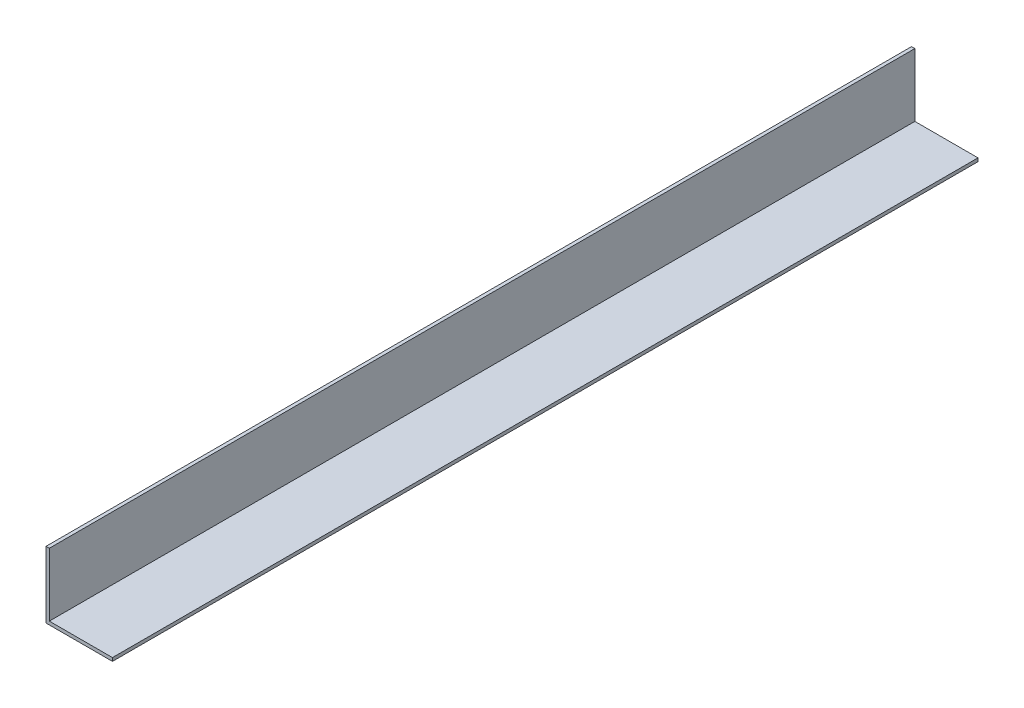
ISO-10303-21;
HEADER;
FILE_DESCRIPTION(('STEP AP214'),'2;1');
FILE_NAME('part.step','',(''),(''),'','','');
FILE_SCHEMA(('AUTOMOTIVE_DESIGN { 1 0 10303 214 1 1 1 1 }'));
ENDSEC;
DATA;
#1=APPLICATION_CONTEXT('core data for automotive mechanical design processes');
#2=APPLICATION_PROTOCOL_DEFINITION('international standard','automotive_design',2000,#1);
#3=PRODUCT_CONTEXT('',#1,'mechanical');
#4=PRODUCT('Part','Part','',(#3));
#5=PRODUCT_RELATED_PRODUCT_CATEGORY('part','',(#4));
#6=PRODUCT_DEFINITION_FORMATION('','',#4);
#7=PRODUCT_DEFINITION_CONTEXT('part definition',#1,'design');
#8=PRODUCT_DEFINITION('design','',#6,#7);
#9=PRODUCT_DEFINITION_SHAPE('','',#8);
#10=(LENGTH_UNIT() NAMED_UNIT(*) SI_UNIT(.MILLI.,.METRE.));
#11=(NAMED_UNIT(*) PLANE_ANGLE_UNIT() SI_UNIT($,.RADIAN.));
#12=(NAMED_UNIT(*) SI_UNIT($,.STERADIAN.) SOLID_ANGLE_UNIT());
#13=UNCERTAINTY_MEASURE_WITH_UNIT(LENGTH_MEASURE(1.E-05),#10,'distance_accuracy_value','');
#14=(GEOMETRIC_REPRESENTATION_CONTEXT(3) GLOBAL_UNCERTAINTY_ASSIGNED_CONTEXT((#13)) GLOBAL_UNIT_ASSIGNED_CONTEXT((#10,
#11,#12)) REPRESENTATION_CONTEXT('',''));
#15=CARTESIAN_POINT('',(0.,0.,0.));
#16=DIRECTION('',(0.,0.,1.));
#17=DIRECTION('',(1.,0.,0.));
#18=AXIS2_PLACEMENT_3D('',#15,#16,#17);
#19=CARTESIAN_POINT('',(0.,0.,521.));
#20=DIRECTION('',(0.,1.,0.));
#21=DIRECTION('',(0.,0.,1.));
#22=AXIS2_PLACEMENT_3D('',#19,#20,#21);
#23=PLANE('',#22);
#24=DIRECTION('',(1.,0.,0.));
#25=VECTOR('',#24,1.);
#26=CARTESIAN_POINT('',(0.,0.,0.));
#27=LINE('',#26,#25);
#28=CARTESIAN_POINT('',(0.,0.,0.));
#29=VERTEX_POINT('',#28);
#30=CARTESIAN_POINT('',(40.,0.,0.));
#31=VERTEX_POINT('',#30);
#32=EDGE_CURVE('E117',#29,#31,#27,.T.);
#33=ORIENTED_EDGE('',*,*,#32,.T.);
#34=DIRECTION('',(0.,0.,-1.));
#35=VECTOR('',#34,1.);
#36=CARTESIAN_POINT('',(40.,0.,521.));
#37=LINE('',#36,#35);
#38=CARTESIAN_POINT('',(40.,0.,521.));
#39=VERTEX_POINT('',#38);
#40=EDGE_CURVE('E11',#39,#31,#37,.T.);
#41=ORIENTED_EDGE('',*,*,#40,.F.);
#42=DIRECTION('',(1.,0.,0.));
#43=VECTOR('',#42,1.);
#44=CARTESIAN_POINT('',(0.,0.,521.));
#45=LINE('',#44,#43);
#46=CARTESIAN_POINT('',(0.,0.,521.));
#47=VERTEX_POINT('',#46);
#48=EDGE_CURVE('E127',#47,#39,#45,.T.);
#49=ORIENTED_EDGE('',*,*,#48,.F.);
#50=DIRECTION('',(0.,0.,-1.));
#51=VECTOR('',#50,1.);
#52=CARTESIAN_POINT('',(0.,0.,521.));
#53=LINE('',#52,#51);
#54=EDGE_CURVE('E113',#47,#29,#53,.T.);
#55=ORIENTED_EDGE('',*,*,#54,.T.);
#56=EDGE_LOOP('',(#33,#41,#49,#55));
#57=FACE_BOUND('',#56,.T.);
#58=ADVANCED_FACE('F33',(#57),#23,.F.);
#59=CARTESIAN_POINT('',(40.,2.,521.));
#60=DIRECTION('',(-1.,0.,0.));
#61=DIRECTION('',(0.,0.,1.));
#62=AXIS2_PLACEMENT_3D('',#59,#60,#61);
#63=PLANE('',#62);
#64=DIRECTION('',(0.,1.,0.));
#65=VECTOR('',#64,1.);
#66=CARTESIAN_POINT('',(40.,2.,0.));
#67=LINE('',#66,#65);
#68=CARTESIAN_POINT('',(40.,2.,0.));
#69=VERTEX_POINT('',#68);
#70=EDGE_CURVE('E120',#31,#69,#67,.T.);
#71=ORIENTED_EDGE('',*,*,#70,.T.);
#72=DIRECTION('',(0.,0.,-1.));
#73=VECTOR('',#72,1.);
#74=CARTESIAN_POINT('',(40.,2.,521.));
#75=LINE('',#74,#73);
#76=CARTESIAN_POINT('',(40.,2.,521.));
#77=VERTEX_POINT('',#76);
#78=EDGE_CURVE('E41',#77,#69,#75,.T.);
#79=ORIENTED_EDGE('',*,*,#78,.F.);
#80=DIRECTION('',(0.,1.,0.));
#81=VECTOR('',#80,1.);
#82=CARTESIAN_POINT('',(40.,2.,521.));
#83=LINE('',#82,#81);
#84=EDGE_CURVE('E86',#39,#77,#83,.T.);
#85=ORIENTED_EDGE('',*,*,#84,.F.);
#86=ORIENTED_EDGE('',*,*,#40,.T.);
#87=EDGE_LOOP('',(#71,#79,#85,#86));
#88=FACE_BOUND('',#87,.T.);
#89=ADVANCED_FACE('F151',(#88),#63,.F.);
#90=CARTESIAN_POINT('',(2.,2.,521.));
#91=DIRECTION('',(0.,-1.,0.));
#92=DIRECTION('',(0.,0.,-1.));
#93=AXIS2_PLACEMENT_3D('',#90,#91,#92);
#94=PLANE('',#93);
#95=DIRECTION('',(-1.,0.,0.));
#96=VECTOR('',#95,1.);
#97=CARTESIAN_POINT('',(2.,2.,0.));
#98=LINE('',#97,#96);
#99=CARTESIAN_POINT('',(2.,2.,0.));
#100=VERTEX_POINT('',#99);
#101=EDGE_CURVE('E122',#69,#100,#98,.T.);
#102=ORIENTED_EDGE('',*,*,#101,.T.);
#103=DIRECTION('',(0.,0.,-1.));
#104=VECTOR('',#103,1.);
#105=CARTESIAN_POINT('',(2.,2.,521.));
#106=LINE('',#105,#104);
#107=CARTESIAN_POINT('',(2.,2.,521.));
#108=VERTEX_POINT('',#107);
#109=EDGE_CURVE('E108',#108,#100,#106,.T.);
#110=ORIENTED_EDGE('',*,*,#109,.F.);
#111=DIRECTION('',(-1.,0.,0.));
#112=VECTOR('',#111,1.);
#113=CARTESIAN_POINT('',(2.,2.,521.));
#114=LINE('',#113,#112);
#115=EDGE_CURVE('E99',#77,#108,#114,.T.);
#116=ORIENTED_EDGE('',*,*,#115,.F.);
#117=ORIENTED_EDGE('',*,*,#78,.T.);
#118=EDGE_LOOP('',(#102,#110,#116,#117));
#119=FACE_BOUND('',#118,.T.);
#120=ADVANCED_FACE('F133',(#119),#94,.F.);
#121=CARTESIAN_POINT('',(2.,2.,521.));
#122=DIRECTION('',(-1.,0.,0.));
#123=DIRECTION('',(0.,0.,1.));
#124=AXIS2_PLACEMENT_3D('',#121,#122,#123);
#125=PLANE('',#124);
#126=DIRECTION('',(0.,1.,0.));
#127=VECTOR('',#126,1.);
#128=CARTESIAN_POINT('',(2.,2.,0.));
#129=LINE('',#128,#127);
#130=CARTESIAN_POINT('',(2.,40.,0.));
#131=VERTEX_POINT('',#130);
#132=EDGE_CURVE('E107',#100,#131,#129,.T.);
#133=ORIENTED_EDGE('',*,*,#132,.T.);
#134=DIRECTION('',(0.,0.,-1.));
#135=VECTOR('',#134,1.);
#136=CARTESIAN_POINT('',(2.,40.,521.));
#137=LINE('',#136,#135);
#138=CARTESIAN_POINT('',(2.,40.,521.));
#139=VERTEX_POINT('',#138);
#140=EDGE_CURVE('E104',#139,#131,#137,.T.);
#141=ORIENTED_EDGE('',*,*,#140,.F.);
#142=DIRECTION('',(0.,1.,0.));
#143=VECTOR('',#142,1.);
#144=CARTESIAN_POINT('',(2.,2.,521.));
#145=LINE('',#144,#143);
#146=EDGE_CURVE('E93',#108,#139,#145,.T.);
#147=ORIENTED_EDGE('',*,*,#146,.F.);
#148=ORIENTED_EDGE('',*,*,#109,.T.);
#149=EDGE_LOOP('',(#133,#141,#147,#148));
#150=FACE_BOUND('',#149,.T.);
#151=ADVANCED_FACE('F105',(#150),#125,.F.);
#152=CARTESIAN_POINT('',(0.,40.,521.));
#153=DIRECTION('',(0.,-1.,0.));
#154=DIRECTION('',(0.,0.,-1.));
#155=AXIS2_PLACEMENT_3D('',#152,#153,#154);
#156=PLANE('',#155);
#157=DIRECTION('',(-1.,0.,0.));
#158=VECTOR('',#157,1.);
#159=CARTESIAN_POINT('',(0.,40.,0.));
#160=LINE('',#159,#158);
#161=CARTESIAN_POINT('',(0.,40.,0.));
#162=VERTEX_POINT('',#161);
#163=EDGE_CURVE('E72',#131,#162,#160,.T.);
#164=ORIENTED_EDGE('',*,*,#163,.T.);
#165=DIRECTION('',(0.,0.,-1.));
#166=VECTOR('',#165,1.);
#167=CARTESIAN_POINT('',(0.,40.,521.));
#168=LINE('',#167,#166);
#169=CARTESIAN_POINT('',(0.,40.,521.));
#170=VERTEX_POINT('',#169);
#171=EDGE_CURVE('E109',#170,#162,#168,.T.);
#172=ORIENTED_EDGE('',*,*,#171,.F.);
#173=DIRECTION('',(-1.,0.,0.));
#174=VECTOR('',#173,1.);
#175=CARTESIAN_POINT('',(0.,40.,521.));
#176=LINE('',#175,#174);
#177=EDGE_CURVE('E97',#139,#170,#176,.T.);
#178=ORIENTED_EDGE('',*,*,#177,.F.);
#179=ORIENTED_EDGE('',*,*,#140,.T.);
#180=EDGE_LOOP('',(#164,#172,#178,#179));
#181=FACE_BOUND('',#180,.T.);
#182=ADVANCED_FACE('F111',(#181),#156,.F.);
#183=CARTESIAN_POINT('',(0.,0.,521.));
#184=DIRECTION('',(1.,0.,0.));
#185=DIRECTION('',(0.,0.,-1.));
#186=AXIS2_PLACEMENT_3D('',#183,#184,#185);
#187=PLANE('',#186);
#188=DIRECTION('',(0.,-1.,0.));
#189=VECTOR('',#188,1.);
#190=CARTESIAN_POINT('',(0.,0.,0.));
#191=LINE('',#190,#189);
#192=EDGE_CURVE('E78',#162,#29,#191,.T.);
#193=ORIENTED_EDGE('',*,*,#192,.T.);
#194=ORIENTED_EDGE('',*,*,#54,.F.);
#195=DIRECTION('',(0.,-1.,0.));
#196=VECTOR('',#195,1.);
#197=CARTESIAN_POINT('',(0.,0.,521.));
#198=LINE('',#197,#196);
#199=EDGE_CURVE('E49',#170,#47,#198,.T.);
#200=ORIENTED_EDGE('',*,*,#199,.F.);
#201=ORIENTED_EDGE('',*,*,#171,.T.);
#202=EDGE_LOOP('',(#193,#194,#200,#201));
#203=FACE_BOUND('',#202,.T.);
#204=ADVANCED_FACE('F140',(#203),#187,.F.);
#205=CARTESIAN_POINT('',(0.,0.,521.));
#206=DIRECTION('',(0.,0.,-1.));
#207=DIRECTION('',(-1.,0.,0.));
#208=AXIS2_PLACEMENT_3D('',#205,#206,#207);
#209=PLANE('',#208);
#210=ORIENTED_EDGE('',*,*,#48,.T.);
#211=ORIENTED_EDGE('',*,*,#84,.T.);
#212=ORIENTED_EDGE('',*,*,#115,.T.);
#213=ORIENTED_EDGE('',*,*,#146,.T.);
#214=ORIENTED_EDGE('',*,*,#177,.T.);
#215=ORIENTED_EDGE('',*,*,#199,.T.);
#216=EDGE_LOOP('',(#210,#211,#212,#213,#214,#215));
#217=FACE_BOUND('',#216,.T.);
#218=ADVANCED_FACE('F95',(#217),#209,.F.);
#219=CARTESIAN_POINT('',(0.,0.,0.));
#220=DIRECTION('',(0.,0.,-1.));
#221=DIRECTION('',(-1.,0.,0.));
#222=AXIS2_PLACEMENT_3D('',#219,#220,#221);
#223=PLANE('',#222);
#224=ORIENTED_EDGE('',*,*,#32,.F.);
#225=ORIENTED_EDGE('',*,*,#192,.F.);
#226=ORIENTED_EDGE('',*,*,#163,.F.);
#227=ORIENTED_EDGE('',*,*,#132,.F.);
#228=ORIENTED_EDGE('',*,*,#101,.F.);
#229=ORIENTED_EDGE('',*,*,#70,.F.);
#230=EDGE_LOOP('',(#224,#225,#226,#227,#228,#229));
#231=FACE_BOUND('',#230,.T.);
#232=ADVANCED_FACE('F136',(#231),#223,.T.);
#233=CLOSED_SHELL('',(#58,#89,#120,#151,#182,#204,#218,#232));
#234=MANIFOLD_SOLID_BREP('B2',#233);
#235=ADVANCED_BREP_SHAPE_REPRESENTATION('',(#18,#234),#14);
#236=SHAPE_DEFINITION_REPRESENTATION(#9,#235);
ENDSEC;
END-ISO-10303-21;
